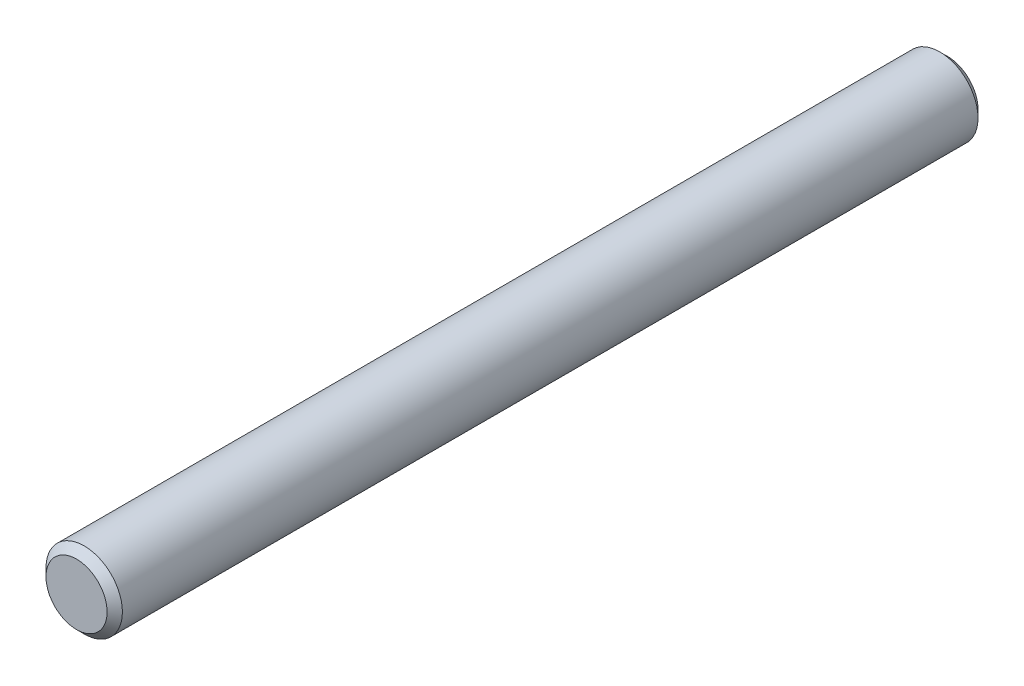
ISO-10303-21;
HEADER;
FILE_DESCRIPTION(('STEP AP214'),'2;1');
FILE_NAME('part.step','',(''),(''),'','','');
FILE_SCHEMA(('AUTOMOTIVE_DESIGN { 1 0 10303 214 1 1 1 1 }'));
ENDSEC;
DATA;
#1=APPLICATION_CONTEXT('core data for automotive mechanical design processes');
#2=APPLICATION_PROTOCOL_DEFINITION('international standard','automotive_design',2000,#1);
#3=PRODUCT_CONTEXT('',#1,'mechanical');
#4=PRODUCT('Part','Part','',(#3));
#5=PRODUCT_RELATED_PRODUCT_CATEGORY('part','',(#4));
#6=PRODUCT_DEFINITION_FORMATION('','',#4);
#7=PRODUCT_DEFINITION_CONTEXT('part definition',#1,'design');
#8=PRODUCT_DEFINITION('design','',#6,#7);
#9=PRODUCT_DEFINITION_SHAPE('','',#8);
#10=(LENGTH_UNIT() NAMED_UNIT(*) SI_UNIT(.MILLI.,.METRE.));
#11=(NAMED_UNIT(*) PLANE_ANGLE_UNIT() SI_UNIT($,.RADIAN.));
#12=(NAMED_UNIT(*) SI_UNIT($,.STERADIAN.) SOLID_ANGLE_UNIT());
#13=UNCERTAINTY_MEASURE_WITH_UNIT(LENGTH_MEASURE(1.E-05),#10,'distance_accuracy_value','');
#14=(GEOMETRIC_REPRESENTATION_CONTEXT(3) GLOBAL_UNCERTAINTY_ASSIGNED_CONTEXT((#13)) GLOBAL_UNIT_ASSIGNED_CONTEXT((#10,
#11,#12)) REPRESENTATION_CONTEXT('',''));
#15=CARTESIAN_POINT('',(0.,0.,0.));
#16=DIRECTION('',(0.,0.,1.));
#17=DIRECTION('',(1.,0.,0.));
#18=AXIS2_PLACEMENT_3D('',#15,#16,#17);
#19=CARTESIAN_POINT('',(0.,0.,57.));
#20=DIRECTION('',(0.,0.,1.));
#21=DIRECTION('',(1.,0.,0.));
#22=AXIS2_PLACEMENT_3D('',#19,#20,#21);
#23=PLANE('',#22);
#24=CARTESIAN_POINT('',(0.,0.,57.0000000000164));
#25=DIRECTION('',(0.,0.,-1.));
#26=DIRECTION('',(-1.,0.,0.));
#27=AXIS2_PLACEMENT_3D('',#24,#25,#26);
#28=CIRCLE('',#27,2.00000000006639);
#29=CARTESIAN_POINT('',(-2.00000000006639,0.,57.0000000000164));
#30=VERTEX_POINT('',#29);
#31=EDGE_CURVE('E18',#30,#30,#28,.T.);
#32=ORIENTED_EDGE('',*,*,#31,.F.);
#33=EDGE_LOOP('',(#32));
#34=FACE_BOUND('',#33,.T.);
#35=ADVANCED_FACE('F15',(#34),#23,.T.);
#36=CARTESIAN_POINT('',(0.,0.,0.));
#37=DIRECTION('',(0.,0.,1.));
#38=DIRECTION('',(1.,0.,0.));
#39=AXIS2_PLACEMENT_3D('',#36,#37,#38);
#40=PLANE('',#39);
#41=CARTESIAN_POINT('',(0.,0.,-5.6843418860808E-11));
#42=DIRECTION('',(0.,0.,1.));
#43=DIRECTION('',(1.,0.,0.));
#44=AXIS2_PLACEMENT_3D('',#41,#42,#43);
#45=CIRCLE('',#44,1.9999999999527);
#46=CARTESIAN_POINT('',(1.9999999999527,0.,-5.6843418860808E-11));
#47=VERTEX_POINT('',#46);
#48=EDGE_CURVE('E27',#47,#47,#45,.T.);
#49=ORIENTED_EDGE('',*,*,#48,.F.);
#50=EDGE_LOOP('',(#49));
#51=FACE_BOUND('',#50,.T.);
#52=ADVANCED_FACE('F38',(#51),#40,.F.);
#53=CARTESIAN_POINT('',(0.,0.,56.500000000085));
#54=DIRECTION('',(0.,0.,-1.));
#55=DIRECTION('',(-1.,0.,0.));
#56=AXIS2_PLACEMENT_3D('',#53,#54,#55);
#57=CONICAL_SURFACE('',#56,2.49999999999772,0.785398163397448);
#58=CARTESIAN_POINT('',(0.,0.,56.5));
#59=DIRECTION('',(0.,0.,1.));
#60=DIRECTION('',(1.,0.,0.));
#61=AXIS2_PLACEMENT_3D('',#58,#59,#60);
#62=CIRCLE('',#61,2.5);
#63=CARTESIAN_POINT('',(2.5,0.,56.5));
#64=VERTEX_POINT('',#63);
#65=EDGE_CURVE('E22',#64,#64,#62,.F.);
#66=ORIENTED_EDGE('',*,*,#65,.F.);
#67=EDGE_LOOP('',(#66));
#68=FACE_BOUND('',#67,.T.);
#69=ORIENTED_EDGE('',*,*,#31,.T.);
#70=EDGE_LOOP('',(#69));
#71=FACE_BOUND('',#70,.T.);
#72=ADVANCED_FACE('F35',(#68,#71),#57,.T.);
#73=CARTESIAN_POINT('',(0.,0.,0.50000000004502));
#74=DIRECTION('',(0.,0.,1.));
#75=DIRECTION('',(1.,0.,0.));
#76=AXIS2_PLACEMENT_3D('',#73,#74,#75);
#77=CONICAL_SURFACE('',#76,2.50000000005457,0.785398163397448);
#78=ORIENTED_EDGE('',*,*,#48,.T.);
#79=EDGE_LOOP('',(#78));
#80=FACE_BOUND('',#79,.T.);
#81=CARTESIAN_POINT('',(0.,0.,0.5));
#82=DIRECTION('',(0.,0.,1.));
#83=DIRECTION('',(1.,0.,0.));
#84=AXIS2_PLACEMENT_3D('',#81,#82,#83);
#85=CIRCLE('',#84,2.5);
#86=CARTESIAN_POINT('',(2.5,0.,0.5));
#87=VERTEX_POINT('',#86);
#88=EDGE_CURVE('E10',#87,#87,#85,.T.);
#89=ORIENTED_EDGE('',*,*,#88,.F.);
#90=EDGE_LOOP('',(#89));
#91=FACE_BOUND('',#90,.T.);
#92=ADVANCED_FACE('F47',(#80,#91),#77,.T.);
#93=CARTESIAN_POINT('',(0.,0.,0.));
#94=DIRECTION('',(0.,0.,1.));
#95=DIRECTION('',(1.,0.,0.));
#96=AXIS2_PLACEMENT_3D('',#93,#94,#95);
#97=CYLINDRICAL_SURFACE('',#96,2.5);
#98=ORIENTED_EDGE('',*,*,#88,.T.);
#99=EDGE_LOOP('',(#98));
#100=FACE_BOUND('',#99,.T.);
#101=ORIENTED_EDGE('',*,*,#65,.T.);
#102=EDGE_LOOP('',(#101));
#103=FACE_BOUND('',#102,.T.);
#104=ADVANCED_FACE('F45',(#100,#103),#97,.T.);
#105=CLOSED_SHELL('',(#35,#52,#72,#92,#104));
#106=MANIFOLD_SOLID_BREP('B1',#105);
#107=ADVANCED_BREP_SHAPE_REPRESENTATION('',(#18,#106),#14);
#108=SHAPE_DEFINITION_REPRESENTATION(#9,#107);
ENDSEC;
END-ISO-10303-21;
